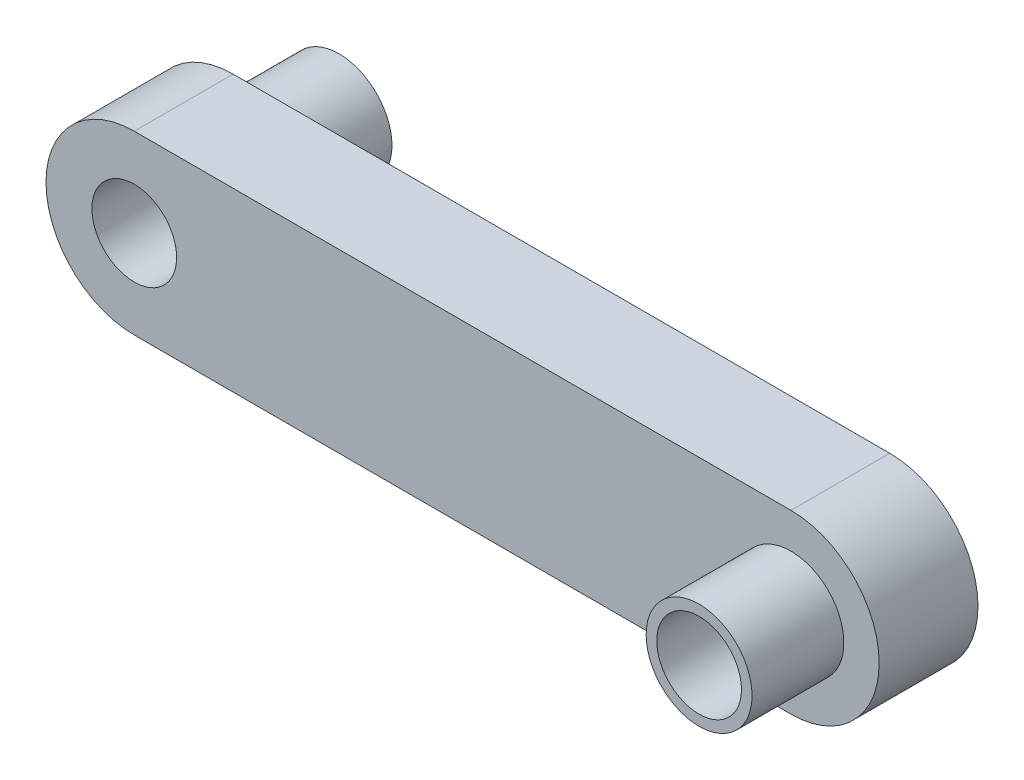
ISO-10303-21;
HEADER;
FILE_DESCRIPTION(('STEP AP214'),'2;1');
FILE_NAME('part.step','',(''),(''),'','','');
FILE_SCHEMA(('AUTOMOTIVE_DESIGN { 1 0 10303 214 1 1 1 1 }'));
ENDSEC;
DATA;
#1=APPLICATION_CONTEXT('core data for automotive mechanical design processes');
#2=APPLICATION_PROTOCOL_DEFINITION('international standard','automotive_design',2000,#1);
#3=PRODUCT_CONTEXT('',#1,'mechanical');
#4=PRODUCT('Part','Part','',(#3));
#5=PRODUCT_RELATED_PRODUCT_CATEGORY('part','',(#4));
#6=PRODUCT_DEFINITION_FORMATION('','',#4);
#7=PRODUCT_DEFINITION_CONTEXT('part definition',#1,'design');
#8=PRODUCT_DEFINITION('design','',#6,#7);
#9=PRODUCT_DEFINITION_SHAPE('','',#8);
#10=(LENGTH_UNIT() NAMED_UNIT(*) SI_UNIT(.MILLI.,.METRE.));
#11=(NAMED_UNIT(*) PLANE_ANGLE_UNIT() SI_UNIT($,.RADIAN.));
#12=(NAMED_UNIT(*) SI_UNIT($,.STERADIAN.) SOLID_ANGLE_UNIT());
#13=UNCERTAINTY_MEASURE_WITH_UNIT(LENGTH_MEASURE(1.E-05),#10,'distance_accuracy_value','');
#14=(GEOMETRIC_REPRESENTATION_CONTEXT(3) GLOBAL_UNCERTAINTY_ASSIGNED_CONTEXT((#13)) GLOBAL_UNIT_ASSIGNED_CONTEXT((#10,
#11,#12)) REPRESENTATION_CONTEXT('',''));
#15=CARTESIAN_POINT('',(0.,0.,0.));
#16=DIRECTION('',(0.,0.,1.));
#17=DIRECTION('',(1.,0.,0.));
#18=AXIS2_PLACEMENT_3D('',#15,#16,#17);
#19=CARTESIAN_POINT('',(0.,0.,-4.));
#20=DIRECTION('',(0.,0.,-1.));
#21=DIRECTION('',(-1.,0.,0.));
#22=AXIS2_PLACEMENT_3D('',#19,#20,#21);
#23=PLANE('',#22);
#24=CARTESIAN_POINT('',(93.,0.,-4.));
#25=DIRECTION('',(0.,0.,-1.));
#26=DIRECTION('',(-1.,0.,0.));
#27=AXIS2_PLACEMENT_3D('',#24,#25,#26);
#28=CIRCLE('',#27,6.);
#29=CARTESIAN_POINT('',(99.,0.,-4.));
#30=VERTEX_POINT('',#29);
#31=EDGE_CURVE('E118',#30,#30,#28,.F.);
#32=ORIENTED_EDGE('',*,*,#31,.T.);
#33=EDGE_LOOP('',(#32));
#34=FACE_BOUND('',#33,.T.);
#35=DIRECTION('',(-1.,0.,0.));
#36=VECTOR('',#35,1.);
#37=CARTESIAN_POINT('',(0.,-12.5,-4.));
#38=LINE('',#37,#36);
#39=CARTESIAN_POINT('',(93.,-12.5,-4.));
#40=VERTEX_POINT('',#39);
#41=CARTESIAN_POINT('',(0.,-12.5,-4.));
#42=VERTEX_POINT('',#41);
#43=EDGE_CURVE('E94',#40,#42,#38,.T.);
#44=ORIENTED_EDGE('',*,*,#43,.T.);
#45=CARTESIAN_POINT('',(0.,0.,-4.));
#46=DIRECTION('',(0.,0.,-1.));
#47=DIRECTION('',(-1.,0.,0.));
#48=AXIS2_PLACEMENT_3D('',#45,#46,#47);
#49=CIRCLE('',#48,12.5);
#50=CARTESIAN_POINT('',(0.,12.5,-4.));
#51=VERTEX_POINT('',#50);
#52=EDGE_CURVE('E99',#42,#51,#49,.T.);
#53=ORIENTED_EDGE('',*,*,#52,.T.);
#54=DIRECTION('',(1.,0.,0.));
#55=VECTOR('',#54,1.);
#56=CARTESIAN_POINT('',(0.,12.5,-4.));
#57=LINE('',#56,#55);
#58=CARTESIAN_POINT('',(93.,12.5,-4.));
#59=VERTEX_POINT('',#58);
#60=EDGE_CURVE('E103',#51,#59,#57,.T.);
#61=ORIENTED_EDGE('',*,*,#60,.T.);
#62=CARTESIAN_POINT('',(93.,0.,-4.));
#63=DIRECTION('',(0.,0.,-1.));
#64=DIRECTION('',(-1.,0.,0.));
#65=AXIS2_PLACEMENT_3D('',#62,#63,#64);
#66=CIRCLE('',#65,12.5);
#67=EDGE_CURVE('E108',#59,#40,#66,.T.);
#68=ORIENTED_EDGE('',*,*,#67,.T.);
#69=EDGE_LOOP('',(#44,#53,#61,#68));
#70=FACE_BOUND('',#69,.T.);
#71=CARTESIAN_POINT('',(0.,0.,-4.));
#72=DIRECTION('',(0.,0.,-1.));
#73=DIRECTION('',(-1.,0.,0.));
#74=AXIS2_PLACEMENT_3D('',#71,#72,#73);
#75=CIRCLE('',#74,7.5);
#76=CARTESIAN_POINT('',(-7.5,0.,-4.));
#77=VERTEX_POINT('',#76);
#78=EDGE_CURVE('E186',#77,#77,#75,.T.);
#79=ORIENTED_EDGE('',*,*,#78,.F.);
#80=EDGE_LOOP('',(#79));
#81=FACE_BOUND('',#80,.T.);
#82=ADVANCED_FACE('F48',(#34,#70,#81),#23,.T.);
#83=CARTESIAN_POINT('',(0.,0.,10.));
#84=DIRECTION('',(0.,0.,1.));
#85=DIRECTION('',(1.,0.,0.));
#86=AXIS2_PLACEMENT_3D('',#83,#84,#85);
#87=PLANE('',#86);
#88=CARTESIAN_POINT('',(0.,0.,10.));
#89=DIRECTION('',(0.,0.,1.));
#90=DIRECTION('',(1.,0.,0.));
#91=AXIS2_PLACEMENT_3D('',#88,#89,#90);
#92=CIRCLE('',#91,6.);
#93=CARTESIAN_POINT('',(6.,0.,10.));
#94=VERTEX_POINT('',#93);
#95=EDGE_CURVE('E109',#94,#94,#92,.T.);
#96=ORIENTED_EDGE('',*,*,#95,.F.);
#97=EDGE_LOOP('',(#96));
#98=FACE_BOUND('',#97,.T.);
#99=DIRECTION('',(1.,0.,0.));
#100=VECTOR('',#99,1.);
#101=CARTESIAN_POINT('',(0.,-12.5,10.));
#102=LINE('',#101,#100);
#103=CARTESIAN_POINT('',(0.,-12.5,10.));
#104=VERTEX_POINT('',#103);
#105=CARTESIAN_POINT('',(93.,-12.5,10.));
#106=VERTEX_POINT('',#105);
#107=EDGE_CURVE('E95',#104,#106,#102,.T.);
#108=ORIENTED_EDGE('',*,*,#107,.T.);
#109=CARTESIAN_POINT('',(93.,0.,10.));
#110=DIRECTION('',(0.,0.,1.));
#111=DIRECTION('',(1.,0.,0.));
#112=AXIS2_PLACEMENT_3D('',#109,#110,#111);
#113=CIRCLE('',#112,12.5);
#114=CARTESIAN_POINT('',(93.,12.5,10.));
#115=VERTEX_POINT('',#114);
#116=EDGE_CURVE('E131',#106,#115,#113,.T.);
#117=ORIENTED_EDGE('',*,*,#116,.T.);
#118=DIRECTION('',(1.,0.,0.));
#119=VECTOR('',#118,1.);
#120=CARTESIAN_POINT('',(0.,12.5,10.));
#121=LINE('',#120,#119);
#122=CARTESIAN_POINT('',(0.,12.5,10.));
#123=VERTEX_POINT('',#122);
#124=EDGE_CURVE('E133',#123,#115,#121,.T.);
#125=ORIENTED_EDGE('',*,*,#124,.F.);
#126=CARTESIAN_POINT('',(0.,0.,10.));
#127=DIRECTION('',(0.,0.,1.));
#128=DIRECTION('',(1.,0.,0.));
#129=AXIS2_PLACEMENT_3D('',#126,#127,#128);
#130=CIRCLE('',#129,12.5);
#131=EDGE_CURVE('E63',#123,#104,#130,.T.);
#132=ORIENTED_EDGE('',*,*,#131,.T.);
#133=EDGE_LOOP('',(#108,#117,#125,#132));
#134=FACE_BOUND('',#133,.T.);
#135=CARTESIAN_POINT('',(93.,0.,10.));
#136=DIRECTION('',(0.,0.,1.));
#137=DIRECTION('',(1.,0.,0.));
#138=AXIS2_PLACEMENT_3D('',#135,#136,#137);
#139=CIRCLE('',#138,7.5);
#140=CARTESIAN_POINT('',(85.5,0.,10.));
#141=VERTEX_POINT('',#140);
#142=EDGE_CURVE('E124',#141,#141,#139,.T.);
#143=ORIENTED_EDGE('',*,*,#142,.F.);
#144=EDGE_LOOP('',(#143));
#145=FACE_BOUND('',#144,.T.);
#146=ADVANCED_FACE('F140',(#98,#134,#145),#87,.T.);
#147=CARTESIAN_POINT('',(0.,-12.5,10.));
#148=DIRECTION('',(0.,1.,0.));
#149=DIRECTION('',(0.,0.,1.));
#150=AXIS2_PLACEMENT_3D('',#147,#148,#149);
#151=PLANE('',#150);
#152=DIRECTION('',(0.,0.,-1.));
#153=VECTOR('',#152,1.);
#154=CARTESIAN_POINT('',(0.,-12.5,10.));
#155=LINE('',#154,#153);
#156=EDGE_CURVE('E90',#104,#42,#155,.T.);
#157=ORIENTED_EDGE('',*,*,#156,.T.);
#158=ORIENTED_EDGE('',*,*,#43,.F.);
#159=DIRECTION('',(0.,0.,-1.));
#160=VECTOR('',#159,1.);
#161=CARTESIAN_POINT('',(93.,-12.5,10.));
#162=LINE('',#161,#160);
#163=EDGE_CURVE('E13',#106,#40,#162,.T.);
#164=ORIENTED_EDGE('',*,*,#163,.F.);
#165=ORIENTED_EDGE('',*,*,#107,.F.);
#166=EDGE_LOOP('',(#157,#158,#164,#165));
#167=FACE_BOUND('',#166,.T.);
#168=ADVANCED_FACE('F50',(#167),#151,.F.);
#169=CARTESIAN_POINT('',(93.,0.,10.));
#170=DIRECTION('',(0.,0.,-1.));
#171=DIRECTION('',(-1.,0.,0.));
#172=AXIS2_PLACEMENT_3D('',#169,#170,#171);
#173=CYLINDRICAL_SURFACE('',#172,12.5);
#174=ORIENTED_EDGE('',*,*,#163,.T.);
#175=ORIENTED_EDGE('',*,*,#67,.F.);
#176=DIRECTION('',(0.,0.,-1.));
#177=VECTOR('',#176,1.);
#178=CARTESIAN_POINT('',(93.,12.5,10.));
#179=LINE('',#178,#177);
#180=EDGE_CURVE('E56',#115,#59,#179,.T.);
#181=ORIENTED_EDGE('',*,*,#180,.F.);
#182=ORIENTED_EDGE('',*,*,#116,.F.);
#183=EDGE_LOOP('',(#174,#175,#181,#182));
#184=FACE_BOUND('',#183,.T.);
#185=ADVANCED_FACE('F139',(#184),#173,.T.);
#186=CARTESIAN_POINT('',(0.,12.5,10.));
#187=DIRECTION('',(0.,1.,0.));
#188=DIRECTION('',(0.,0.,1.));
#189=AXIS2_PLACEMENT_3D('',#186,#187,#188);
#190=PLANE('',#189);
#191=ORIENTED_EDGE('',*,*,#180,.T.);
#192=ORIENTED_EDGE('',*,*,#60,.F.);
#193=DIRECTION('',(0.,0.,-1.));
#194=VECTOR('',#193,1.);
#195=CARTESIAN_POINT('',(0.,12.5,10.));
#196=LINE('',#195,#194);
#197=EDGE_CURVE('E71',#123,#51,#196,.T.);
#198=ORIENTED_EDGE('',*,*,#197,.F.);
#199=ORIENTED_EDGE('',*,*,#124,.T.);
#200=EDGE_LOOP('',(#191,#192,#198,#199));
#201=FACE_BOUND('',#200,.T.);
#202=ADVANCED_FACE('F137',(#201),#190,.T.);
#203=CARTESIAN_POINT('',(0.,0.,10.));
#204=DIRECTION('',(0.,0.,-1.));
#205=DIRECTION('',(-1.,0.,0.));
#206=AXIS2_PLACEMENT_3D('',#203,#204,#205);
#207=CYLINDRICAL_SURFACE('',#206,12.5);
#208=ORIENTED_EDGE('',*,*,#197,.T.);
#209=ORIENTED_EDGE('',*,*,#52,.F.);
#210=ORIENTED_EDGE('',*,*,#156,.F.);
#211=ORIENTED_EDGE('',*,*,#131,.F.);
#212=EDGE_LOOP('',(#208,#209,#210,#211));
#213=FACE_BOUND('',#212,.T.);
#214=ADVANCED_FACE('F100',(#213),#207,.T.);
#215=CARTESIAN_POINT('',(93.,0.,-21.2132034355965));
#216=DIRECTION('',(0.,0.,1.));
#217=DIRECTION('',(1.,0.,0.));
#218=AXIS2_PLACEMENT_3D('',#215,#216,#217);
#219=CYLINDRICAL_SURFACE('',#218,6.);
#220=CARTESIAN_POINT('',(93.,0.,23.));
#221=DIRECTION('',(0.,0.,1.));
#222=DIRECTION('',(1.,0.,0.));
#223=AXIS2_PLACEMENT_3D('',#220,#221,#222);
#224=CIRCLE('',#223,6.);
#225=CARTESIAN_POINT('',(99.,0.,23.));
#226=VERTEX_POINT('',#225);
#227=EDGE_CURVE('E121',#226,#226,#224,.T.);
#228=CARTESIAN_POINT('',(99.,0.,23.));
#229=CARTESIAN_POINT('',(99.,0.,22.71875));
#230=CARTESIAN_POINT('',(99.,0.,22.4375));
#231=CARTESIAN_POINT('',(99.,0.,21.875));
#232=CARTESIAN_POINT('',(99.,0.,21.59375));
#233=CARTESIAN_POINT('',(99.,0.,21.03125));
#234=CARTESIAN_POINT('',(99.,0.,20.75));
#235=CARTESIAN_POINT('',(99.,0.,20.1875));
#236=CARTESIAN_POINT('',(99.,0.,19.90625));
#237=CARTESIAN_POINT('',(99.,0.,19.34375));
#238=CARTESIAN_POINT('',(99.,0.,19.0625));
#239=CARTESIAN_POINT('',(99.,0.,18.5));
#240=CARTESIAN_POINT('',(99.,0.,18.21875));
#241=CARTESIAN_POINT('',(99.,0.,17.65625));
#242=CARTESIAN_POINT('',(99.,0.,17.375));
#243=CARTESIAN_POINT('',(99.,0.,16.8125));
#244=CARTESIAN_POINT('',(99.,0.,16.53125));
#245=CARTESIAN_POINT('',(99.,0.,15.96875));
#246=CARTESIAN_POINT('',(99.,0.,15.6875));
#247=CARTESIAN_POINT('',(99.,0.,15.125));
#248=CARTESIAN_POINT('',(99.,0.,14.84375));
#249=CARTESIAN_POINT('',(99.,0.,14.28125));
#250=CARTESIAN_POINT('',(99.,0.,14.));
#251=CARTESIAN_POINT('',(99.,0.,13.4375));
#252=CARTESIAN_POINT('',(99.,0.,13.15625));
#253=CARTESIAN_POINT('',(99.,0.,12.59375));
#254=CARTESIAN_POINT('',(99.,0.,12.3125));
#255=CARTESIAN_POINT('',(99.,0.,11.75));
#256=CARTESIAN_POINT('',(99.,0.,11.46875));
#257=CARTESIAN_POINT('',(99.,0.,10.90625));
#258=CARTESIAN_POINT('',(99.,0.,10.625));
#259=CARTESIAN_POINT('',(99.,0.,10.0625));
#260=CARTESIAN_POINT('',(99.,0.,9.78125));
#261=CARTESIAN_POINT('',(99.,0.,9.21875));
#262=CARTESIAN_POINT('',(99.,0.,8.9375));
#263=CARTESIAN_POINT('',(99.,0.,8.375));
#264=CARTESIAN_POINT('',(99.,0.,8.09375));
#265=CARTESIAN_POINT('',(99.,0.,7.53125));
#266=CARTESIAN_POINT('',(99.,0.,7.25));
#267=CARTESIAN_POINT('',(99.,0.,6.6875));
#268=CARTESIAN_POINT('',(99.,0.,6.40625));
#269=CARTESIAN_POINT('',(99.,0.,5.84375));
#270=CARTESIAN_POINT('',(99.,0.,5.5625));
#271=CARTESIAN_POINT('',(99.,0.,5.));
#272=CARTESIAN_POINT('',(99.,0.,4.71875));
#273=CARTESIAN_POINT('',(99.,0.,4.15625));
#274=CARTESIAN_POINT('',(99.,0.,3.875));
#275=CARTESIAN_POINT('',(99.,0.,3.3125));
#276=CARTESIAN_POINT('',(99.,0.,3.03125));
#277=CARTESIAN_POINT('',(99.,0.,2.46875));
#278=CARTESIAN_POINT('',(99.,0.,2.1875));
#279=CARTESIAN_POINT('',(99.,0.,1.625));
#280=CARTESIAN_POINT('',(99.,0.,1.34375));
#281=CARTESIAN_POINT('',(99.,0.,0.781249999999998));
#282=CARTESIAN_POINT('',(99.,0.,0.499999999999999));
#283=CARTESIAN_POINT('',(99.,0.,-0.0625000000000001));
#284=CARTESIAN_POINT('',(99.,0.,-0.34375));
#285=CARTESIAN_POINT('',(99.,0.,-0.906250000000001));
#286=CARTESIAN_POINT('',(99.,0.,-1.1875));
#287=CARTESIAN_POINT('',(99.,0.,-1.75));
#288=CARTESIAN_POINT('',(99.,0.,-2.03125));
#289=CARTESIAN_POINT('',(99.,0.,-2.59375));
#290=CARTESIAN_POINT('',(99.,0.,-2.875));
#291=CARTESIAN_POINT('',(99.,0.,-3.4375));
#292=CARTESIAN_POINT('',(99.,0.,-3.71875));
#293=CARTESIAN_POINT('',(99.,0.,-4.));
#294=B_SPLINE_CURVE_WITH_KNOTS('',3,(#228,#229,#230,#231,#232,#233,#234,#235,#236,#237,#238,
#239,#240,#241,#242,#243,#244,#245,#246,#247,#248,#249,#250,#251,#252,#253,#254,#255,#256,#257,
#258,#259,#260,#261,#262,#263,#264,#265,#266,#267,#268,#269,#270,#271,#272,#273,#274,#275,#276,
#277,#278,#279,#280,#281,#282,#283,#284,#285,#286,#287,#288,#289,#290,#291,#292,#293),
.UNSPECIFIED.,.F.,.F.,(4,2,2,2,2,2,2,2,2,2,2,2,2,2,2,2,2,2,2,2,2,2,2,2,2,2,2,2,2,2,2,2,4),(0.,
0.843749999999997,1.6875,2.53125,3.375,4.21875,5.0625,5.90625,6.75,7.59375,8.4375,9.28125,
10.125,10.96875,11.8125,12.65625,13.5,14.34375,15.1875,16.03125,16.875,17.71875,18.5625,
19.40625,20.25,21.09375,21.9375,22.78125,23.625,24.46875,25.3125,26.15625,27.),.UNSPECIFIED.);
#295=EDGE_CURVE('BSEAM160',#226,#30,#294,.T.);
#296=ORIENTED_EDGE('',*,*,#227,.T.);
#297=ORIENTED_EDGE('',*,*,#31,.F.);
#298=ORIENTED_EDGE('',*,*,#295,.T.);
#299=ORIENTED_EDGE('',*,*,#295,.F.);
#300=EDGE_LOOP('',(#296,#298,#297,#299));
#301=FACE_BOUND('',#300,.T.);
#302=ADVANCED_FACE('F160',(#301),#219,.F.);
#303=CARTESIAN_POINT('',(93.,0.,23.));
#304=DIRECTION('',(0.,0.,1.));
#305=DIRECTION('',(1.,0.,0.));
#306=AXIS2_PLACEMENT_3D('',#303,#304,#305);
#307=PLANE('',#306);
#308=CARTESIAN_POINT('',(93.,0.,23.));
#309=DIRECTION('',(0.,0.,1.));
#310=DIRECTION('',(1.,0.,0.));
#311=AXIS2_PLACEMENT_3D('',#308,#309,#310);
#312=CIRCLE('',#311,7.5);
#313=CARTESIAN_POINT('',(85.5,0.,23.));
#314=VERTEX_POINT('',#313);
#315=EDGE_CURVE('E125',#314,#314,#312,.T.);
#316=ORIENTED_EDGE('',*,*,#315,.T.);
#317=EDGE_LOOP('',(#316));
#318=FACE_BOUND('',#317,.T.);
#319=ORIENTED_EDGE('',*,*,#227,.F.);
#320=EDGE_LOOP('',(#319));
#321=FACE_BOUND('',#320,.T.);
#322=ADVANCED_FACE('F150',(#318,#321),#307,.T.);
#323=CARTESIAN_POINT('',(93.,0.,23.));
#324=DIRECTION('',(0.,0.,-1.));
#325=DIRECTION('',(-1.,0.,0.));
#326=AXIS2_PLACEMENT_3D('',#323,#324,#325);
#327=CYLINDRICAL_SURFACE('',#326,7.5);
#328=CARTESIAN_POINT('',(85.5,0.,23.));
#329=CARTESIAN_POINT('',(85.5,0.,22.8645833333333));
#330=CARTESIAN_POINT('',(85.5,0.,22.7291666666667));
#331=CARTESIAN_POINT('',(85.5,0.,22.4583333333333));
#332=CARTESIAN_POINT('',(85.5,0.,22.3229166666667));
#333=CARTESIAN_POINT('',(85.5,0.,22.0520833333333));
#334=CARTESIAN_POINT('',(85.5,0.,21.9166666666667));
#335=CARTESIAN_POINT('',(85.5,0.,21.6458333333333));
#336=CARTESIAN_POINT('',(85.5,0.,21.5104166666667));
#337=CARTESIAN_POINT('',(85.5,0.,21.2395833333333));
#338=CARTESIAN_POINT('',(85.5,0.,21.1041666666667));
#339=CARTESIAN_POINT('',(85.5,0.,20.8333333333333));
#340=CARTESIAN_POINT('',(85.5,0.,20.6979166666667));
#341=CARTESIAN_POINT('',(85.5,0.,20.4270833333333));
#342=CARTESIAN_POINT('',(85.5,0.,20.2916666666667));
#343=CARTESIAN_POINT('',(85.5,0.,20.0208333333333));
#344=CARTESIAN_POINT('',(85.5,0.,19.8854166666667));
#345=CARTESIAN_POINT('',(85.5,0.,19.6145833333333));
#346=CARTESIAN_POINT('',(85.5,0.,19.4791666666667));
#347=CARTESIAN_POINT('',(85.5,0.,19.2083333333333));
#348=CARTESIAN_POINT('',(85.5,0.,19.0729166666667));
#349=CARTESIAN_POINT('',(85.5,0.,18.8020833333333));
#350=CARTESIAN_POINT('',(85.5,0.,18.6666666666667));
#351=CARTESIAN_POINT('',(85.5,0.,18.3958333333333));
#352=CARTESIAN_POINT('',(85.5,0.,18.2604166666667));
#353=CARTESIAN_POINT('',(85.5,0.,17.9895833333333));
#354=CARTESIAN_POINT('',(85.5,0.,17.8541666666667));
#355=CARTESIAN_POINT('',(85.5,0.,17.5833333333333));
#356=CARTESIAN_POINT('',(85.5,0.,17.4479166666667));
#357=CARTESIAN_POINT('',(85.5,0.,17.1770833333333));
#358=CARTESIAN_POINT('',(85.5,0.,17.0416666666667));
#359=CARTESIAN_POINT('',(85.5,0.,16.7708333333333));
#360=CARTESIAN_POINT('',(85.5,0.,16.6354166666667));
#361=CARTESIAN_POINT('',(85.5,0.,16.3645833333333));
#362=CARTESIAN_POINT('',(85.5,0.,16.2291666666667));
#363=CARTESIAN_POINT('',(85.5,0.,15.9583333333333));
#364=CARTESIAN_POINT('',(85.5,0.,15.8229166666667));
#365=CARTESIAN_POINT('',(85.5,0.,15.5520833333333));
#366=CARTESIAN_POINT('',(85.5,0.,15.4166666666667));
#367=CARTESIAN_POINT('',(85.5,0.,15.1458333333333));
#368=CARTESIAN_POINT('',(85.5,0.,15.0104166666667));
#369=CARTESIAN_POINT('',(85.5,0.,14.7395833333333));
#370=CARTESIAN_POINT('',(85.5,0.,14.6041666666667));
#371=CARTESIAN_POINT('',(85.5,0.,14.3333333333333));
#372=CARTESIAN_POINT('',(85.5,0.,14.1979166666667));
#373=CARTESIAN_POINT('',(85.5,0.,13.9270833333333));
#374=CARTESIAN_POINT('',(85.5,0.,13.7916666666667));
#375=CARTESIAN_POINT('',(85.5,0.,13.5208333333333));
#376=CARTESIAN_POINT('',(85.5,0.,13.3854166666667));
#377=CARTESIAN_POINT('',(85.5,0.,13.1145833333333));
#378=CARTESIAN_POINT('',(85.5,0.,12.9791666666667));
#379=CARTESIAN_POINT('',(85.5,0.,12.7083333333333));
#380=CARTESIAN_POINT('',(85.5,0.,12.5729166666667));
#381=CARTESIAN_POINT('',(85.5,0.,12.3020833333333));
#382=CARTESIAN_POINT('',(85.5,0.,12.1666666666667));
#383=CARTESIAN_POINT('',(85.5,0.,11.8958333333333));
#384=CARTESIAN_POINT('',(85.5,0.,11.7604166666667));
#385=CARTESIAN_POINT('',(85.5,0.,11.4895833333333));
#386=CARTESIAN_POINT('',(85.5,0.,11.3541666666667));
#387=CARTESIAN_POINT('',(85.5,0.,11.0833333333333));
#388=CARTESIAN_POINT('',(85.5,0.,10.9479166666667));
#389=CARTESIAN_POINT('',(85.5,0.,10.6770833333333));
#390=CARTESIAN_POINT('',(85.5,0.,10.5416666666667));
#391=CARTESIAN_POINT('',(85.5,0.,10.2708333333333));
#392=CARTESIAN_POINT('',(85.5,0.,10.1354166666667));
#393=CARTESIAN_POINT('',(85.5,0.,10.));
#394=B_SPLINE_CURVE_WITH_KNOTS('',3,(#328,#329,#330,#331,#332,#333,#334,#335,#336,#337,#338,
#339,#340,#341,#342,#343,#344,#345,#346,#347,#348,#349,#350,#351,#352,#353,#354,#355,#356,#357,
#358,#359,#360,#361,#362,#363,#364,#365,#366,#367,#368,#369,#370,#371,#372,#373,#374,#375,#376,
#377,#378,#379,#380,#381,#382,#383,#384,#385,#386,#387,#388,#389,#390,#391,#392,#393),
.UNSPECIFIED.,.F.,.F.,(4,2,2,2,2,2,2,2,2,2,2,2,2,2,2,2,2,2,2,2,2,2,2,2,2,2,2,2,2,2,2,2,4),(0.,
0.40625,0.812500000000001,1.21875,1.625,2.03125,2.4375,2.84375,3.25,3.65625,4.0625,4.46875,
4.875,5.28125,5.6875,6.09375,6.5,6.90625,7.3125,7.71875,8.125,8.53125,8.9375,9.34375,9.75,
10.15625,10.5625,10.96875,11.375,11.78125,12.1875,12.59375,13.),.UNSPECIFIED.);
#395=EDGE_CURVE('BSEAM147',#314,#141,#394,.T.);
#396=ORIENTED_EDGE('',*,*,#315,.F.);
#397=ORIENTED_EDGE('',*,*,#142,.T.);
#398=ORIENTED_EDGE('',*,*,#395,.T.);
#399=ORIENTED_EDGE('',*,*,#395,.F.);
#400=EDGE_LOOP('',(#396,#398,#397,#399));
#401=FACE_BOUND('',#400,.T.);
#402=ADVANCED_FACE('F147',(#401),#327,.T.);
#403=CARTESIAN_POINT('',(0.,0.,23.));
#404=DIRECTION('',(0.,0.,-1.));
#405=DIRECTION('',(-1.,0.,0.));
#406=AXIS2_PLACEMENT_3D('',#403,#404,#405);
#407=CYLINDRICAL_SURFACE('',#406,6.);
#408=ORIENTED_EDGE('',*,*,#95,.T.);
#409=EDGE_LOOP('',(#408));
#410=FACE_BOUND('',#409,.T.);
#411=CARTESIAN_POINT('',(0.,0.,-19.));
#412=DIRECTION('',(0.,0.,-1.));
#413=DIRECTION('',(-1.,0.,0.));
#414=AXIS2_PLACEMENT_3D('',#411,#412,#413);
#415=CIRCLE('',#414,6.);
#416=CARTESIAN_POINT('',(-6.,0.,-19.));
#417=VERTEX_POINT('',#416);
#418=EDGE_CURVE('E184',#417,#417,#415,.T.);
#419=ORIENTED_EDGE('',*,*,#418,.T.);
#420=EDGE_LOOP('',(#419));
#421=FACE_BOUND('',#420,.T.);
#422=ADVANCED_FACE('F149',(#410,#421),#407,.F.);
#423=CARTESIAN_POINT('',(0.,0.,-19.));
#424=DIRECTION('',(0.,0.,-1.));
#425=DIRECTION('',(-1.,0.,0.));
#426=AXIS2_PLACEMENT_3D('',#423,#424,#425);
#427=PLANE('',#426);
#428=CARTESIAN_POINT('',(0.,0.,-19.));
#429=DIRECTION('',(0.,0.,-1.));
#430=DIRECTION('',(-1.,0.,0.));
#431=AXIS2_PLACEMENT_3D('',#428,#429,#430);
#432=CIRCLE('',#431,7.5);
#433=CARTESIAN_POINT('',(-7.5,0.,-19.));
#434=VERTEX_POINT('',#433);
#435=EDGE_CURVE('E112',#434,#434,#432,.T.);
#436=ORIENTED_EDGE('',*,*,#435,.T.);
#437=EDGE_LOOP('',(#436));
#438=FACE_BOUND('',#437,.T.);
#439=ORIENTED_EDGE('',*,*,#418,.F.);
#440=EDGE_LOOP('',(#439));
#441=FACE_BOUND('',#440,.T.);
#442=ADVANCED_FACE('F157',(#438,#441),#427,.T.);
#443=CARTESIAN_POINT('',(0.,0.,-19.));
#444=DIRECTION('',(0.,0.,1.));
#445=DIRECTION('',(1.,0.,0.));
#446=AXIS2_PLACEMENT_3D('',#443,#444,#445);
#447=CYLINDRICAL_SURFACE('',#446,7.5);
#448=ORIENTED_EDGE('',*,*,#435,.F.);
#449=EDGE_LOOP('',(#448));
#450=FACE_BOUND('',#449,.T.);
#451=ORIENTED_EDGE('',*,*,#78,.T.);
#452=EDGE_LOOP('',(#451));
#453=FACE_BOUND('',#452,.T.);
#454=ADVANCED_FACE('F171',(#450,#453),#447,.T.);
#455=CLOSED_SHELL('',(#82,#146,#168,#185,#202,#214,#302,#322,#402,#422,#442,#454));
#456=MANIFOLD_SOLID_BREP('B2',#455);
#457=ADVANCED_BREP_SHAPE_REPRESENTATION('',(#18,#456),#14);
#458=SHAPE_DEFINITION_REPRESENTATION(#9,#457);
ENDSEC;
END-ISO-10303-21;
